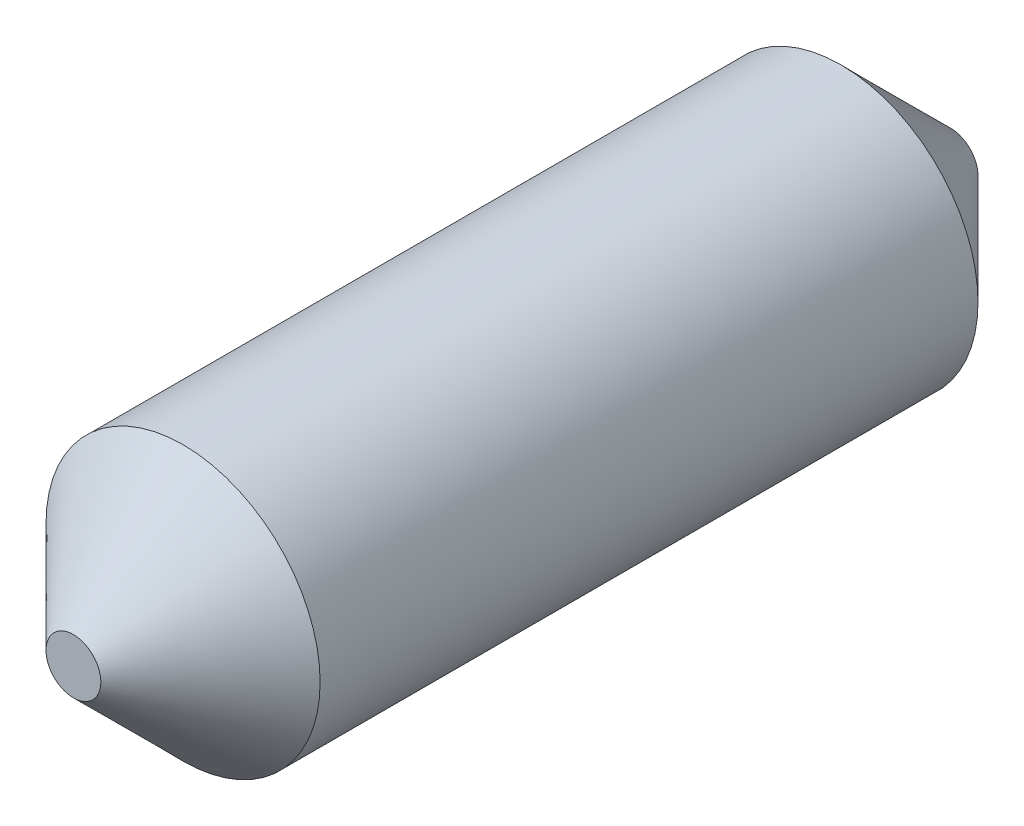
ISO-10303-21;
HEADER;
FILE_DESCRIPTION(('STEP AP214'),'2;1');
FILE_NAME('part.step','',(''),(''),'','','');
FILE_SCHEMA(('AUTOMOTIVE_DESIGN { 1 0 10303 214 1 1 1 1 }'));
ENDSEC;
DATA;
#1=APPLICATION_CONTEXT('core data for automotive mechanical design processes');
#2=APPLICATION_PROTOCOL_DEFINITION('international standard','automotive_design',2000,#1);
#3=PRODUCT_CONTEXT('',#1,'mechanical');
#4=PRODUCT('Part','Part','',(#3));
#5=PRODUCT_RELATED_PRODUCT_CATEGORY('part','',(#4));
#6=PRODUCT_DEFINITION_FORMATION('','',#4);
#7=PRODUCT_DEFINITION_CONTEXT('part definition',#1,'design');
#8=PRODUCT_DEFINITION('design','',#6,#7);
#9=PRODUCT_DEFINITION_SHAPE('','',#8);
#10=(LENGTH_UNIT() NAMED_UNIT(*) SI_UNIT(.MILLI.,.METRE.));
#11=(NAMED_UNIT(*) PLANE_ANGLE_UNIT() SI_UNIT($,.RADIAN.));
#12=(NAMED_UNIT(*) SI_UNIT($,.STERADIAN.) SOLID_ANGLE_UNIT());
#13=UNCERTAINTY_MEASURE_WITH_UNIT(LENGTH_MEASURE(1.E-05),#10,'distance_accuracy_value','');
#14=(GEOMETRIC_REPRESENTATION_CONTEXT(3) GLOBAL_UNCERTAINTY_ASSIGNED_CONTEXT((#13)) GLOBAL_UNIT_ASSIGNED_CONTEXT((#10,
#11,#12)) REPRESENTATION_CONTEXT('',''));
#15=CARTESIAN_POINT('',(0.,0.,0.));
#16=DIRECTION('',(0.,0.,1.));
#17=DIRECTION('',(1.,0.,0.));
#18=AXIS2_PLACEMENT_3D('',#15,#16,#17);
#19=CARTESIAN_POINT('',(0.,0.,8.));
#20=DIRECTION('',(0.,0.,-1.));
#21=DIRECTION('',(-1.,0.,0.));
#22=AXIS2_PLACEMENT_3D('',#19,#20,#21);
#23=CYLINDRICAL_SURFACE('',#22,1.25);
#24=CARTESIAN_POINT('',(0.,0.,6.99999999999999));
#25=DIRECTION('',(0.,0.,1.));
#26=DIRECTION('',(1.,0.,0.));
#27=AXIS2_PLACEMENT_3D('',#24,#25,#26);
#28=CIRCLE('',#27,1.25);
#29=CARTESIAN_POINT('',(-1.25,0.,6.99999999999999));
#30=VERTEX_POINT('',#29);
#31=EDGE_CURVE('E45',#30,#30,#28,.F.);
#32=ORIENTED_EDGE('',*,*,#31,.T.);
#33=EDGE_LOOP('',(#32));
#34=FACE_BOUND('',#33,.T.);
#35=CARTESIAN_POINT('',(0.,0.,1.));
#36=DIRECTION('',(0.,0.,1.));
#37=DIRECTION('',(1.,0.,0.));
#38=AXIS2_PLACEMENT_3D('',#35,#36,#37);
#39=CIRCLE('',#38,1.25);
#40=CARTESIAN_POINT('',(1.25,0.,1.));
#41=VERTEX_POINT('',#40);
#42=EDGE_CURVE('E50',#41,#41,#39,.T.);
#43=ORIENTED_EDGE('',*,*,#42,.T.);
#44=EDGE_LOOP('',(#43));
#45=FACE_BOUND('',#44,.T.);
#46=ADVANCED_FACE('F37',(#34,#45),#23,.T.);
#47=CARTESIAN_POINT('',(0.,0.,8.));
#48=DIRECTION('',(0.,0.,1.));
#49=DIRECTION('',(1.,0.,0.));
#50=AXIS2_PLACEMENT_3D('',#47,#48,#49);
#51=PLANE('',#50);
#52=CARTESIAN_POINT('',(0.,0.,8.));
#53=DIRECTION('',(0.,0.,1.));
#54=DIRECTION('',(1.,0.,0.));
#55=AXIS2_PLACEMENT_3D('',#52,#53,#54);
#56=CIRCLE('',#55,0.25);
#57=CARTESIAN_POINT('',(-0.250000000000001,0.,8.));
#58=VERTEX_POINT('',#57);
#59=EDGE_CURVE('E55',#58,#58,#56,.T.);
#60=ORIENTED_EDGE('',*,*,#59,.T.);
#61=EDGE_LOOP('',(#60));
#62=FACE_BOUND('',#61,.T.);
#63=ADVANCED_FACE('F62',(#62),#51,.T.);
#64=CARTESIAN_POINT('',(0.,0.,0.));
#65=DIRECTION('',(0.,0.,1.));
#66=DIRECTION('',(1.,0.,0.));
#67=AXIS2_PLACEMENT_3D('',#64,#65,#66);
#68=PLANE('',#67);
#69=CARTESIAN_POINT('',(0.,0.,0.));
#70=DIRECTION('',(0.,0.,1.));
#71=DIRECTION('',(1.,0.,0.));
#72=AXIS2_PLACEMENT_3D('',#69,#70,#71);
#73=CIRCLE('',#72,0.249999999999997);
#74=CARTESIAN_POINT('',(0.249999999999997,0.,0.));
#75=VERTEX_POINT('',#74);
#76=EDGE_CURVE('E10',#75,#75,#73,.F.);
#77=ORIENTED_EDGE('',*,*,#76,.T.);
#78=EDGE_LOOP('',(#77));
#79=FACE_BOUND('',#78,.T.);
#80=ADVANCED_FACE('F66',(#79),#68,.F.);
#81=CARTESIAN_POINT('',(0.,0.,8.));
#82=DIRECTION('',(0.,0.,-1.));
#83=DIRECTION('',(-1.,0.,0.));
#84=AXIS2_PLACEMENT_3D('',#81,#82,#83);
#85=CONICAL_SURFACE('',#84,0.25,0.785398163397446);
#86=CARTESIAN_POINT('',(-1.25,0.,6.99999999999999));
#87=CARTESIAN_POINT('',(-1.23958333333334,0.,7.01041666666666));
#88=CARTESIAN_POINT('',(-1.22916666666667,0.,7.02083333333333));
#89=CARTESIAN_POINT('',(-1.20833333333333,0.,7.04166666666666));
#90=CARTESIAN_POINT('',(-1.19791666666667,0.,7.05208333333333));
#91=CARTESIAN_POINT('',(-1.17708333333334,0.,7.07291666666666));
#92=CARTESIAN_POINT('',(-1.16666666666667,0.,7.08333333333333));
#93=CARTESIAN_POINT('',(-1.14583333333334,0.,7.10416666666666));
#94=CARTESIAN_POINT('',(-1.13541666666667,0.,7.11458333333333));
#95=CARTESIAN_POINT('',(-1.11458333333333,0.,7.13541666666666));
#96=CARTESIAN_POINT('',(-1.10416666666667,0.,7.14583333333333));
#97=CARTESIAN_POINT('',(-1.08333333333333,0.,7.16666666666666));
#98=CARTESIAN_POINT('',(-1.07291666666667,0.,7.17708333333333));
#99=CARTESIAN_POINT('',(-1.05208333333333,0.,7.19791666666666));
#100=CARTESIAN_POINT('',(-1.04166666666667,0.,7.20833333333333));
#101=CARTESIAN_POINT('',(-1.02083333333334,0.,7.22916666666666));
#102=CARTESIAN_POINT('',(-1.01041666666667,0.,7.23958333333333));
#103=CARTESIAN_POINT('',(-0.989583333333335,0.,7.26041666666666));
#104=CARTESIAN_POINT('',(-0.979166666666668,0.,7.27083333333333));
#105=CARTESIAN_POINT('',(-0.958333333333335,0.,7.29166666666666));
#106=CARTESIAN_POINT('',(-0.947916666666668,0.,7.30208333333333));
#107=CARTESIAN_POINT('',(-0.927083333333335,0.,7.32291666666666));
#108=CARTESIAN_POINT('',(-0.916666666666668,0.,7.33333333333333));
#109=CARTESIAN_POINT('',(-0.895833333333335,0.,7.35416666666666));
#110=CARTESIAN_POINT('',(-0.885416666666668,0.,7.36458333333333));
#111=CARTESIAN_POINT('',(-0.864583333333335,0.,7.38541666666666));
#112=CARTESIAN_POINT('',(-0.854166666666668,0.,7.39583333333333));
#113=CARTESIAN_POINT('',(-0.833333333333335,0.,7.41666666666666));
#114=CARTESIAN_POINT('',(-0.822916666666668,0.,7.42708333333333));
#115=CARTESIAN_POINT('',(-0.802083333333335,0.,7.44791666666666));
#116=CARTESIAN_POINT('',(-0.791666666666668,0.,7.45833333333333));
#117=CARTESIAN_POINT('',(-0.770833333333335,0.,7.47916666666666));
#118=CARTESIAN_POINT('',(-0.760416666666668,0.,7.48958333333333));
#119=CARTESIAN_POINT('',(-0.739583333333335,0.,7.51041666666666));
#120=CARTESIAN_POINT('',(-0.729166666666668,0.,7.52083333333333));
#121=CARTESIAN_POINT('',(-0.708333333333335,0.,7.54166666666666));
#122=CARTESIAN_POINT('',(-0.697916666666668,0.,7.55208333333333));
#123=CARTESIAN_POINT('',(-0.677083333333335,0.,7.57291666666666));
#124=CARTESIAN_POINT('',(-0.666666666666668,0.,7.58333333333333));
#125=CARTESIAN_POINT('',(-0.645833333333335,0.,7.60416666666666));
#126=CARTESIAN_POINT('',(-0.635416666666668,0.,7.61458333333333));
#127=CARTESIAN_POINT('',(-0.614583333333335,0.,7.63541666666666));
#128=CARTESIAN_POINT('',(-0.604166666666668,0.,7.64583333333333));
#129=CARTESIAN_POINT('',(-0.583333333333335,0.,7.66666666666666));
#130=CARTESIAN_POINT('',(-0.572916666666668,0.,7.67708333333333));
#131=CARTESIAN_POINT('',(-0.552083333333335,0.,7.69791666666666));
#132=CARTESIAN_POINT('',(-0.541666666666668,0.,7.70833333333333));
#133=CARTESIAN_POINT('',(-0.520833333333335,0.,7.72916666666666));
#134=CARTESIAN_POINT('',(-0.510416666666668,0.,7.73958333333333));
#135=CARTESIAN_POINT('',(-0.489583333333335,0.,7.76041666666666));
#136=CARTESIAN_POINT('',(-0.479166666666668,0.,7.77083333333333));
#137=CARTESIAN_POINT('',(-0.458333333333335,0.,7.79166666666666));
#138=CARTESIAN_POINT('',(-0.447916666666668,0.,7.80208333333333));
#139=CARTESIAN_POINT('',(-0.427083333333335,0.,7.82291666666667));
#140=CARTESIAN_POINT('',(-0.416666666666668,0.,7.83333333333333));
#141=CARTESIAN_POINT('',(-0.395833333333335,0.,7.85416666666667));
#142=CARTESIAN_POINT('',(-0.385416666666668,0.,7.86458333333333));
#143=CARTESIAN_POINT('',(-0.364583333333334,0.,7.88541666666667));
#144=CARTESIAN_POINT('',(-0.354166666666668,0.,7.89583333333333));
#145=CARTESIAN_POINT('',(-0.333333333333334,0.,7.91666666666667));
#146=CARTESIAN_POINT('',(-0.322916666666668,0.,7.92708333333333));
#147=CARTESIAN_POINT('',(-0.302083333333334,0.,7.94791666666667));
#148=CARTESIAN_POINT('',(-0.291666666666668,0.,7.95833333333333));
#149=CARTESIAN_POINT('',(-0.270833333333334,0.,7.97916666666667));
#150=CARTESIAN_POINT('',(-0.260416666666668,0.,7.98958333333333));
#151=CARTESIAN_POINT('',(-0.250000000000001,0.,8.));
#152=B_SPLINE_CURVE_WITH_KNOTS('',3,(#86,#87,#88,#89,#90,#91,#92,#93,#94,#95,#96,#97,#98,#99,
#100,#101,#102,#103,#104,#105,#106,#107,#108,#109,#110,#111,#112,#113,#114,#115,#116,#117,#118,
#119,#120,#121,#122,#123,#124,#125,#126,#127,#128,#129,#130,#131,#132,#133,#134,#135,#136,#137,
#138,#139,#140,#141,#142,#143,#144,#145,#146,#147,#148,#149,#150,#151),.UNSPECIFIED.,.F.,.F.,(4,
2,2,2,2,2,2,2,2,2,2,2,2,2,2,2,2,2,2,2,2,2,2,2,2,2,2,2,2,2,2,2,4),(0.,0.04419417382416,
0.0883883476483191,0.132582521472478,0.176776695296638,0.220970869120797,0.265165042944956,
0.309359216769116,0.353553390593275,0.397747564417435,0.441941738241594,0.486135912065753,
0.530330085889912,0.574524259714072,0.618718433538231,0.662912607362391,0.70710678118655,
0.751300955010709,0.795495128834869,0.839689302659028,0.883883476483187,0.928077650307347,
0.972271824131506,1.01646599795567,1.06066017177982,1.10485434560398,1.14904851942814,
1.1932426932523,1.23743686707646,1.28163104090062,1.32582521472478,1.37001938854894,
1.4142135623731),.UNSPECIFIED.);
#153=EDGE_CURVE('BSEAM64',#30,#58,#152,.T.);
#154=ORIENTED_EDGE('',*,*,#31,.F.);
#155=ORIENTED_EDGE('',*,*,#59,.F.);
#156=ORIENTED_EDGE('',*,*,#153,.T.);
#157=ORIENTED_EDGE('',*,*,#153,.F.);
#158=EDGE_LOOP('',(#154,#156,#155,#157));
#159=FACE_BOUND('',#158,.T.);
#160=ADVANCED_FACE('F64',(#159),#85,.T.);
#161=CARTESIAN_POINT('',(0.,0.,1.));
#162=DIRECTION('',(0.,0.,1.));
#163=DIRECTION('',(1.,0.,0.));
#164=AXIS2_PLACEMENT_3D('',#161,#162,#163);
#165=CONICAL_SURFACE('',#164,1.25,0.78539816339745);
#166=CARTESIAN_POINT('',(0.249999999999997,0.,0.));
#167=CARTESIAN_POINT('',(0.260416666666663,0.,0.0104166666666667));
#168=CARTESIAN_POINT('',(0.27083333333333,0.,0.0208333333333334));
#169=CARTESIAN_POINT('',(0.291666666666664,0.,0.0416666666666667));
#170=CARTESIAN_POINT('',(0.30208333333333,0.,0.0520833333333334));
#171=CARTESIAN_POINT('',(0.322916666666664,0.,0.0729166666666667));
#172=CARTESIAN_POINT('',(0.33333333333333,0.,0.0833333333333333));
#173=CARTESIAN_POINT('',(0.354166666666664,0.,0.104166666666667));
#174=CARTESIAN_POINT('',(0.36458333333333,0.,0.114583333333333));
#175=CARTESIAN_POINT('',(0.385416666666664,0.,0.135416666666667));
#176=CARTESIAN_POINT('',(0.395833333333331,0.,0.145833333333333));
#177=CARTESIAN_POINT('',(0.416666666666664,0.,0.166666666666667));
#178=CARTESIAN_POINT('',(0.427083333333331,0.,0.177083333333333));
#179=CARTESIAN_POINT('',(0.447916666666664,0.,0.197916666666667));
#180=CARTESIAN_POINT('',(0.458333333333331,0.,0.208333333333333));
#181=CARTESIAN_POINT('',(0.479166666666664,0.,0.229166666666667));
#182=CARTESIAN_POINT('',(0.489583333333331,0.,0.239583333333333));
#183=CARTESIAN_POINT('',(0.510416666666664,0.,0.260416666666667));
#184=CARTESIAN_POINT('',(0.520833333333331,0.,0.270833333333333));
#185=CARTESIAN_POINT('',(0.541666666666665,0.,0.291666666666667));
#186=CARTESIAN_POINT('',(0.552083333333331,0.,0.302083333333333));
#187=CARTESIAN_POINT('',(0.572916666666665,0.,0.322916666666667));
#188=CARTESIAN_POINT('',(0.583333333333331,0.,0.333333333333333));
#189=CARTESIAN_POINT('',(0.604166666666665,0.,0.354166666666667));
#190=CARTESIAN_POINT('',(0.614583333333332,0.,0.364583333333333));
#191=CARTESIAN_POINT('',(0.635416666666665,0.,0.385416666666667));
#192=CARTESIAN_POINT('',(0.645833333333332,0.,0.395833333333333));
#193=CARTESIAN_POINT('',(0.666666666666665,0.,0.416666666666667));
#194=CARTESIAN_POINT('',(0.677083333333332,0.,0.427083333333333));
#195=CARTESIAN_POINT('',(0.697916666666665,0.,0.447916666666667));
#196=CARTESIAN_POINT('',(0.708333333333332,0.,0.458333333333333));
#197=CARTESIAN_POINT('',(0.729166666666665,0.,0.479166666666667));
#198=CARTESIAN_POINT('',(0.739583333333332,0.,0.489583333333333));
#199=CARTESIAN_POINT('',(0.760416666666666,0.,0.510416666666667));
#200=CARTESIAN_POINT('',(0.770833333333332,0.,0.520833333333333));
#201=CARTESIAN_POINT('',(0.791666666666666,0.,0.541666666666667));
#202=CARTESIAN_POINT('',(0.802083333333332,0.,0.552083333333333));
#203=CARTESIAN_POINT('',(0.822916666666666,0.,0.572916666666667));
#204=CARTESIAN_POINT('',(0.833333333333332,0.,0.583333333333333));
#205=CARTESIAN_POINT('',(0.854166666666666,0.,0.604166666666667));
#206=CARTESIAN_POINT('',(0.864583333333333,0.,0.614583333333333));
#207=CARTESIAN_POINT('',(0.885416666666666,0.,0.635416666666667));
#208=CARTESIAN_POINT('',(0.895833333333333,0.,0.645833333333333));
#209=CARTESIAN_POINT('',(0.916666666666666,0.,0.666666666666667));
#210=CARTESIAN_POINT('',(0.927083333333333,0.,0.677083333333333));
#211=CARTESIAN_POINT('',(0.947916666666666,0.,0.697916666666667));
#212=CARTESIAN_POINT('',(0.958333333333333,0.,0.708333333333333));
#213=CARTESIAN_POINT('',(0.979166666666667,0.,0.729166666666667));
#214=CARTESIAN_POINT('',(0.989583333333333,0.,0.739583333333333));
#215=CARTESIAN_POINT('',(1.01041666666667,0.,0.760416666666667));
#216=CARTESIAN_POINT('',(1.02083333333333,0.,0.770833333333333));
#217=CARTESIAN_POINT('',(1.04166666666667,0.,0.791666666666667));
#218=CARTESIAN_POINT('',(1.05208333333333,0.,0.802083333333333));
#219=CARTESIAN_POINT('',(1.07291666666667,0.,0.822916666666667));
#220=CARTESIAN_POINT('',(1.08333333333333,0.,0.833333333333333));
#221=CARTESIAN_POINT('',(1.10416666666667,0.,0.854166666666667));
#222=CARTESIAN_POINT('',(1.11458333333333,0.,0.864583333333333));
#223=CARTESIAN_POINT('',(1.13541666666667,0.,0.885416666666667));
#224=CARTESIAN_POINT('',(1.14583333333333,0.,0.895833333333333));
#225=CARTESIAN_POINT('',(1.16666666666667,0.,0.916666666666667));
#226=CARTESIAN_POINT('',(1.17708333333333,0.,0.927083333333333));
#227=CARTESIAN_POINT('',(1.19791666666667,0.,0.947916666666667));
#228=CARTESIAN_POINT('',(1.20833333333333,0.,0.958333333333333));
#229=CARTESIAN_POINT('',(1.22916666666667,0.,0.979166666666667));
#230=CARTESIAN_POINT('',(1.23958333333333,0.,0.989583333333333));
#231=CARTESIAN_POINT('',(1.25,0.,1.));
#232=B_SPLINE_CURVE_WITH_KNOTS('',3,(#166,#167,#168,#169,#170,#171,#172,#173,#174,#175,#176,
#177,#178,#179,#180,#181,#182,#183,#184,#185,#186,#187,#188,#189,#190,#191,#192,#193,#194,#195,
#196,#197,#198,#199,#200,#201,#202,#203,#204,#205,#206,#207,#208,#209,#210,#211,#212,#213,#214,
#215,#216,#217,#218,#219,#220,#221,#222,#223,#224,#225,#226,#227,#228,#229,#230,#231),
.UNSPECIFIED.,.F.,.F.,(4,2,2,2,2,2,2,2,2,2,2,2,2,2,2,2,2,2,2,2,2,2,2,2,2,2,2,2,2,2,2,2,4),(0.,
0.0441941738241593,0.0883883476483187,0.132582521472478,0.176776695296637,0.220970869120796,
0.265165042944956,0.309359216769115,0.353553390593274,0.397747564417434,0.441941738241593,
0.486135912065752,0.530330085889912,0.574524259714071,0.61871843353823,0.66291260736239,
0.707106781186549,0.751300955010708,0.795495128834868,0.839689302659027,0.883883476483186,
0.928077650307346,0.972271824131505,1.01646599795566,1.06066017177982,1.10485434560398,
1.14904851942814,1.1932426932523,1.23743686707646,1.28163104090062,1.32582521472478,
1.37001938854894,1.4142135623731),.UNSPECIFIED.);
#233=EDGE_CURVE('BSEAM39',#75,#41,#232,.T.);
#234=ORIENTED_EDGE('',*,*,#76,.F.);
#235=ORIENTED_EDGE('',*,*,#42,.F.);
#236=ORIENTED_EDGE('',*,*,#233,.T.);
#237=ORIENTED_EDGE('',*,*,#233,.F.);
#238=EDGE_LOOP('',(#234,#236,#235,#237));
#239=FACE_BOUND('',#238,.T.);
#240=ADVANCED_FACE('F39',(#239),#165,.T.);
#241=CLOSED_SHELL('',(#46,#63,#80,#160,#240));
#242=MANIFOLD_SOLID_BREP('B2',#241);
#243=ADVANCED_BREP_SHAPE_REPRESENTATION('',(#18,#242),#14);
#244=SHAPE_DEFINITION_REPRESENTATION(#9,#243);
ENDSEC;
END-ISO-10303-21;
